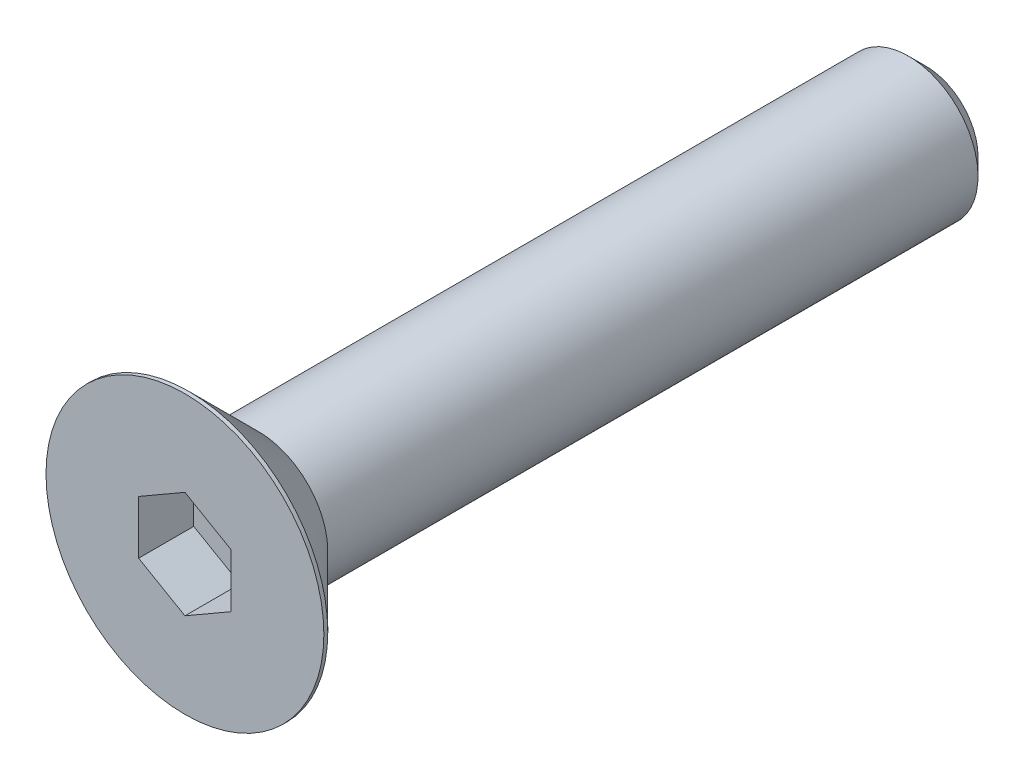
ISO-10303-21;
HEADER;
FILE_DESCRIPTION(('STEP AP214'),'2;1');
FILE_NAME('part.step','',(''),(''),'','','');
FILE_SCHEMA(('AUTOMOTIVE_DESIGN { 1 0 10303 214 1 1 1 1 }'));
ENDSEC;
DATA;
#1=APPLICATION_CONTEXT('core data for automotive mechanical design processes');
#2=APPLICATION_PROTOCOL_DEFINITION('international standard','automotive_design',2000,#1);
#3=PRODUCT_CONTEXT('',#1,'mechanical');
#4=PRODUCT('Part','Part','',(#3));
#5=PRODUCT_RELATED_PRODUCT_CATEGORY('part','',(#4));
#6=PRODUCT_DEFINITION_FORMATION('','',#4);
#7=PRODUCT_DEFINITION_CONTEXT('part definition',#1,'design');
#8=PRODUCT_DEFINITION('design','',#6,#7);
#9=PRODUCT_DEFINITION_SHAPE('','',#8);
#10=(LENGTH_UNIT() NAMED_UNIT(*) SI_UNIT(.MILLI.,.METRE.));
#11=(NAMED_UNIT(*) PLANE_ANGLE_UNIT() SI_UNIT($,.RADIAN.));
#12=(NAMED_UNIT(*) SI_UNIT($,.STERADIAN.) SOLID_ANGLE_UNIT());
#13=UNCERTAINTY_MEASURE_WITH_UNIT(LENGTH_MEASURE(1.E-05),#10,'distance_accuracy_value','');
#14=(GEOMETRIC_REPRESENTATION_CONTEXT(3) GLOBAL_UNCERTAINTY_ASSIGNED_CONTEXT((#13)) GLOBAL_UNIT_ASSIGNED_CONTEXT((#10,
#11,#12)) REPRESENTATION_CONTEXT('',''));
#15=CARTESIAN_POINT('',(0.,0.,0.));
#16=DIRECTION('',(0.,0.,1.));
#17=DIRECTION('',(1.,0.,0.));
#18=AXIS2_PLACEMENT_3D('',#15,#16,#17);
#19=CARTESIAN_POINT('',(0.,0.,7.915));
#20=DIRECTION('',(0.,0.,1.));
#21=DIRECTION('',(0.,-1.,0.));
#22=AXIS2_PLACEMENT_3D('',#19,#20,#21);
#23=CONICAL_SURFACE('',#22,3.,0.785398163397448);
#24=CARTESIAN_POINT('',(0.,0.,6.3));
#25=DIRECTION('',(0.,0.,1.));
#26=DIRECTION('',(0.,-1.,0.));
#27=AXIS2_PLACEMENT_3D('',#24,#25,#26);
#28=CIRCLE('',#27,1.385);
#29=CARTESIAN_POINT('',(0.,-1.385,6.3));
#30=VERTEX_POINT('',#29);
#31=EDGE_CURVE('E150',#30,#30,#28,.T.);
#32=ORIENTED_EDGE('',*,*,#31,.T.);
#33=EDGE_LOOP('',(#32));
#34=FACE_BOUND('',#33,.T.);
#35=CARTESIAN_POINT('',(0.,0.,7.915));
#36=DIRECTION('',(0.,0.,1.));
#37=DIRECTION('',(0.,-1.,0.));
#38=AXIS2_PLACEMENT_3D('',#35,#36,#37);
#39=CIRCLE('',#38,3.);
#40=CARTESIAN_POINT('',(0.,-3.,7.915));
#41=VERTEX_POINT('',#40);
#42=EDGE_CURVE('E12',#41,#41,#39,.T.);
#43=ORIENTED_EDGE('',*,*,#42,.F.);
#44=EDGE_LOOP('',(#43));
#45=FACE_BOUND('',#44,.T.);
#46=ADVANCED_FACE('F49',(#34,#45),#23,.T.);
#47=CARTESIAN_POINT('',(0.,0.,8.));
#48=DIRECTION('',(0.,0.,1.));
#49=DIRECTION('',(0.,-1.,0.));
#50=AXIS2_PLACEMENT_3D('',#47,#48,#49);
#51=CYLINDRICAL_SURFACE('',#50,3.);
#52=ORIENTED_EDGE('',*,*,#42,.T.);
#53=EDGE_LOOP('',(#52));
#54=FACE_BOUND('',#53,.T.);
#55=CARTESIAN_POINT('',(0.,0.,8.));
#56=DIRECTION('',(0.,0.,1.));
#57=DIRECTION('',(0.,-1.,0.));
#58=AXIS2_PLACEMENT_3D('',#55,#56,#57);
#59=CIRCLE('',#58,3.);
#60=CARTESIAN_POINT('',(0.,-3.,8.));
#61=VERTEX_POINT('',#60);
#62=EDGE_CURVE('E56',#61,#61,#59,.T.);
#63=ORIENTED_EDGE('',*,*,#62,.F.);
#64=EDGE_LOOP('',(#63));
#65=FACE_BOUND('',#64,.T.);
#66=ADVANCED_FACE('F162',(#54,#65),#51,.T.);
#67=CARTESIAN_POINT('',(0.,0.,8.));
#68=DIRECTION('',(0.,0.,-1.));
#69=DIRECTION('',(0.,1.,0.));
#70=AXIS2_PLACEMENT_3D('',#67,#68,#69);
#71=PLANE('',#70);
#72=DIRECTION('',(0.,1.,0.));
#73=VECTOR('',#72,1.);
#74=CARTESIAN_POINT('',(1.,-0.577350269189627,8.));
#75=LINE('',#74,#73);
#76=CARTESIAN_POINT('',(1.,-0.577350269189627,8.));
#77=VERTEX_POINT('',#76);
#78=CARTESIAN_POINT('',(1.,0.577350269189625,8.));
#79=VERTEX_POINT('',#78);
#80=EDGE_CURVE('E137',#77,#79,#75,.T.);
#81=ORIENTED_EDGE('',*,*,#80,.F.);
#82=DIRECTION('',(0.866025403784438,0.5,0.));
#83=VECTOR('',#82,1.);
#84=CARTESIAN_POINT('',(0.,-1.15470053837926,8.));
#85=LINE('',#84,#83);
#86=CARTESIAN_POINT('',(0.,-1.15470053837926,8.));
#87=VERTEX_POINT('',#86);
#88=EDGE_CURVE('E63',#87,#77,#85,.T.);
#89=ORIENTED_EDGE('',*,*,#88,.F.);
#90=DIRECTION('',(0.866025403784438,-0.5,0.));
#91=VECTOR('',#90,1.);
#92=CARTESIAN_POINT('',(-1.,-0.577350269189629,8.));
#93=LINE('',#92,#91);
#94=CARTESIAN_POINT('',(-1.,-0.577350269189629,8.));
#95=VERTEX_POINT('',#94);
#96=EDGE_CURVE('E146',#95,#87,#93,.T.);
#97=ORIENTED_EDGE('',*,*,#96,.F.);
#98=DIRECTION('',(0.,-1.,0.));
#99=VECTOR('',#98,1.);
#100=CARTESIAN_POINT('',(-1.,0.577350269189625,8.));
#101=LINE('',#100,#99);
#102=CARTESIAN_POINT('',(-1.,0.577350269189625,8.));
#103=VERTEX_POINT('',#102);
#104=EDGE_CURVE('E144',#103,#95,#101,.T.);
#105=ORIENTED_EDGE('',*,*,#104,.F.);
#106=DIRECTION('',(-0.866025403784439,-0.5,0.));
#107=VECTOR('',#106,1.);
#108=CARTESIAN_POINT('',(0.,1.15470053837925,8.));
#109=LINE('',#108,#107);
#110=CARTESIAN_POINT('',(0.,1.15470053837925,8.));
#111=VERTEX_POINT('',#110);
#112=EDGE_CURVE('E111',#111,#103,#109,.T.);
#113=ORIENTED_EDGE('',*,*,#112,.F.);
#114=DIRECTION('',(-0.866025403784439,0.5,0.));
#115=VECTOR('',#114,1.);
#116=CARTESIAN_POINT('',(1.,0.577350269189625,8.));
#117=LINE('',#116,#115);
#118=EDGE_CURVE('E140',#79,#111,#117,.T.);
#119=ORIENTED_EDGE('',*,*,#118,.F.);
#120=EDGE_LOOP('',(#81,#89,#97,#105,#113,#119));
#121=FACE_BOUND('',#120,.T.);
#122=ORIENTED_EDGE('',*,*,#62,.T.);
#123=EDGE_LOOP('',(#122));
#124=FACE_BOUND('',#123,.T.);
#125=ADVANCED_FACE('F160',(#121,#124),#71,.F.);
#126=CARTESIAN_POINT('',(0.,0.,6.3));
#127=DIRECTION('',(0.,0.,-1.));
#128=DIRECTION('',(0.,1.,0.));
#129=AXIS2_PLACEMENT_3D('',#126,#127,#128);
#130=PLANE('',#129);
#131=ORIENTED_EDGE('',*,*,#31,.F.);
#132=EDGE_LOOP('',(#131));
#133=FACE_BOUND('',#132,.T.);
#134=ADVANCED_FACE('F169',(#133),#130,.T.);
#135=CARTESIAN_POINT('',(0.,-1.15470053837926,6.81));
#136=DIRECTION('',(0.5,-0.866025403784438,0.));
#137=DIRECTION('',(0.866025403784439,0.5,0.));
#138=AXIS2_PLACEMENT_3D('',#135,#136,#137);
#139=PLANE('',#138);
#140=ORIENTED_EDGE('',*,*,#88,.T.);
#141=DIRECTION('',(0.,0.,1.));
#142=VECTOR('',#141,1.);
#143=CARTESIAN_POINT('',(1.,-0.577350269189627,6.81));
#144=LINE('',#143,#142);
#145=CARTESIAN_POINT('',(1.,-0.577350269189627,6.81));
#146=VERTEX_POINT('',#145);
#147=EDGE_CURVE('E93',#146,#77,#144,.T.);
#148=ORIENTED_EDGE('',*,*,#147,.F.);
#149=DIRECTION('',(0.866025403784438,0.5,0.));
#150=VECTOR('',#149,1.);
#151=CARTESIAN_POINT('',(0.,-1.15470053837926,6.81));
#152=LINE('',#151,#150);
#153=CARTESIAN_POINT('',(0.,-1.15470053837926,6.81));
#154=VERTEX_POINT('',#153);
#155=EDGE_CURVE('E148',#154,#146,#152,.T.);
#156=ORIENTED_EDGE('',*,*,#155,.F.);
#157=DIRECTION('',(0.,0.,1.));
#158=VECTOR('',#157,1.);
#159=CARTESIAN_POINT('',(0.,-1.15470053837926,6.81));
#160=LINE('',#159,#158);
#161=EDGE_CURVE('E71',#154,#87,#160,.T.);
#162=ORIENTED_EDGE('',*,*,#161,.T.);
#163=EDGE_LOOP('',(#140,#148,#156,#162));
#164=FACE_BOUND('',#163,.T.);
#165=ADVANCED_FACE('F176',(#164),#139,.F.);
#166=CARTESIAN_POINT('',(-1.,-0.577350269189629,6.81));
#167=DIRECTION('',(-0.5,-0.866025403784439,0.));
#168=DIRECTION('',(0.866025403784439,-0.5,0.));
#169=AXIS2_PLACEMENT_3D('',#166,#167,#168);
#170=PLANE('',#169);
#171=ORIENTED_EDGE('',*,*,#96,.T.);
#172=ORIENTED_EDGE('',*,*,#161,.F.);
#173=DIRECTION('',(0.866025403784438,-0.5,0.));
#174=VECTOR('',#173,1.);
#175=CARTESIAN_POINT('',(-1.,-0.577350269189629,6.81));
#176=LINE('',#175,#174);
#177=CARTESIAN_POINT('',(-1.,-0.577350269189629,6.81));
#178=VERTEX_POINT('',#177);
#179=EDGE_CURVE('E123',#178,#154,#176,.T.);
#180=ORIENTED_EDGE('',*,*,#179,.F.);
#181=DIRECTION('',(0.,0.,1.));
#182=VECTOR('',#181,1.);
#183=CARTESIAN_POINT('',(-1.,-0.577350269189629,6.81));
#184=LINE('',#183,#182);
#185=EDGE_CURVE('E115',#178,#95,#184,.T.);
#186=ORIENTED_EDGE('',*,*,#185,.T.);
#187=EDGE_LOOP('',(#171,#172,#180,#186));
#188=FACE_BOUND('',#187,.T.);
#189=ADVANCED_FACE('F180',(#188),#170,.F.);
#190=CARTESIAN_POINT('',(-1.,0.577350269189625,6.81));
#191=DIRECTION('',(-1.,0.,0.));
#192=DIRECTION('',(0.,-1.,0.));
#193=AXIS2_PLACEMENT_3D('',#190,#191,#192);
#194=PLANE('',#193);
#195=ORIENTED_EDGE('',*,*,#104,.T.);
#196=ORIENTED_EDGE('',*,*,#185,.F.);
#197=DIRECTION('',(0.,-1.,0.));
#198=VECTOR('',#197,1.);
#199=CARTESIAN_POINT('',(-1.,0.577350269189625,6.81));
#200=LINE('',#199,#198);
#201=CARTESIAN_POINT('',(-1.,0.577350269189625,6.81));
#202=VERTEX_POINT('',#201);
#203=EDGE_CURVE('E119',#202,#178,#200,.T.);
#204=ORIENTED_EDGE('',*,*,#203,.F.);
#205=DIRECTION('',(0.,0.,1.));
#206=VECTOR('',#205,1.);
#207=CARTESIAN_POINT('',(-1.,0.577350269189625,6.81));
#208=LINE('',#207,#206);
#209=EDGE_CURVE('E104',#202,#103,#208,.T.);
#210=ORIENTED_EDGE('',*,*,#209,.T.);
#211=EDGE_LOOP('',(#195,#196,#204,#210));
#212=FACE_BOUND('',#211,.T.);
#213=ADVANCED_FACE('F120',(#212),#194,.F.);
#214=CARTESIAN_POINT('',(0.,1.15470053837925,6.81));
#215=DIRECTION('',(-0.5,0.866025403784439,0.));
#216=DIRECTION('',(-0.866025403784439,-0.5,0.));
#217=AXIS2_PLACEMENT_3D('',#214,#215,#216);
#218=PLANE('',#217);
#219=ORIENTED_EDGE('',*,*,#112,.T.);
#220=ORIENTED_EDGE('',*,*,#209,.F.);
#221=DIRECTION('',(-0.866025403784439,-0.5,0.));
#222=VECTOR('',#221,1.);
#223=CARTESIAN_POINT('',(0.,1.15470053837925,6.81));
#224=LINE('',#223,#222);
#225=CARTESIAN_POINT('',(0.,1.15470053837925,6.81));
#226=VERTEX_POINT('',#225);
#227=EDGE_CURVE('E108',#226,#202,#224,.T.);
#228=ORIENTED_EDGE('',*,*,#227,.F.);
#229=DIRECTION('',(0.,0.,1.));
#230=VECTOR('',#229,1.);
#231=CARTESIAN_POINT('',(0.,1.15470053837925,6.81));
#232=LINE('',#231,#230);
#233=EDGE_CURVE('E116',#226,#111,#232,.T.);
#234=ORIENTED_EDGE('',*,*,#233,.T.);
#235=EDGE_LOOP('',(#219,#220,#228,#234));
#236=FACE_BOUND('',#235,.T.);
#237=ADVANCED_FACE('F106',(#236),#218,.F.);
#238=CARTESIAN_POINT('',(1.,0.577350269189625,6.81));
#239=DIRECTION('',(0.5,0.866025403784439,0.));
#240=DIRECTION('',(-0.866025403784439,0.5,0.));
#241=AXIS2_PLACEMENT_3D('',#238,#239,#240);
#242=PLANE('',#241);
#243=ORIENTED_EDGE('',*,*,#118,.T.);
#244=ORIENTED_EDGE('',*,*,#233,.F.);
#245=DIRECTION('',(-0.866025403784439,0.5,0.));
#246=VECTOR('',#245,1.);
#247=CARTESIAN_POINT('',(1.,0.577350269189625,6.81));
#248=LINE('',#247,#246);
#249=CARTESIAN_POINT('',(1.,0.577350269189625,6.81));
#250=VERTEX_POINT('',#249);
#251=EDGE_CURVE('E129',#250,#226,#248,.T.);
#252=ORIENTED_EDGE('',*,*,#251,.F.);
#253=DIRECTION('',(0.,0.,1.));
#254=VECTOR('',#253,1.);
#255=CARTESIAN_POINT('',(1.,0.577350269189625,6.81));
#256=LINE('',#255,#254);
#257=EDGE_CURVE('E153',#250,#79,#256,.T.);
#258=ORIENTED_EDGE('',*,*,#257,.T.);
#259=EDGE_LOOP('',(#243,#244,#252,#258));
#260=FACE_BOUND('',#259,.T.);
#261=ADVANCED_FACE('F184',(#260),#242,.F.);
#262=CARTESIAN_POINT('',(1.,-0.577350269189627,6.81));
#263=DIRECTION('',(1.,0.,0.));
#264=DIRECTION('',(0.,1.,0.));
#265=AXIS2_PLACEMENT_3D('',#262,#263,#264);
#266=PLANE('',#265);
#267=ORIENTED_EDGE('',*,*,#80,.T.);
#268=ORIENTED_EDGE('',*,*,#257,.F.);
#269=DIRECTION('',(0.,1.,0.));
#270=VECTOR('',#269,1.);
#271=CARTESIAN_POINT('',(1.,-0.577350269189627,6.81));
#272=LINE('',#271,#270);
#273=EDGE_CURVE('E131',#146,#250,#272,.T.);
#274=ORIENTED_EDGE('',*,*,#273,.F.);
#275=ORIENTED_EDGE('',*,*,#147,.T.);
#276=EDGE_LOOP('',(#267,#268,#274,#275));
#277=FACE_BOUND('',#276,.T.);
#278=ADVANCED_FACE('F181',(#277),#266,.F.);
#279=CARTESIAN_POINT('',(1.,-0.577350269189627,6.81));
#280=DIRECTION('',(0.,0.,1.));
#281=DIRECTION('',(1.,0.,0.));
#282=AXIS2_PLACEMENT_3D('',#279,#280,#281);
#283=PLANE('',#282);
#284=ORIENTED_EDGE('',*,*,#155,.T.);
#285=ORIENTED_EDGE('',*,*,#273,.T.);
#286=ORIENTED_EDGE('',*,*,#251,.T.);
#287=ORIENTED_EDGE('',*,*,#227,.T.);
#288=ORIENTED_EDGE('',*,*,#203,.T.);
#289=ORIENTED_EDGE('',*,*,#179,.T.);
#290=EDGE_LOOP('',(#284,#285,#286,#287,#288,#289));
#291=FACE_BOUND('',#290,.T.);
#292=ADVANCED_FACE('F126',(#291),#283,.T.);
#293=CLOSED_SHELL('',(#46,#66,#125,#134,#165,#189,#213,#237,#261,#278,#292));
#294=MANIFOLD_SOLID_BREP('B2',#293);
#295=CARTESIAN_POINT('',(0.,-1.50000000000001,6.81000000000001));
#296=DIRECTION('',(0.,0.,-1.));
#297=DIRECTION('',(0.,1.,0.));
#298=AXIS2_PLACEMENT_3D('',#295,#296,#297);
#299=PLANE('',#298);
#300=CARTESIAN_POINT('',(0.,0.,6.81000000000001));
#301=DIRECTION('',(0.,0.,1.));
#302=DIRECTION('',(0.,-1.,0.));
#303=AXIS2_PLACEMENT_3D('',#300,#301,#302);
#304=CIRCLE('',#303,1.50000000000001);
#305=CARTESIAN_POINT('',(0.,-1.50000000000001,6.81000000000001));
#306=VERTEX_POINT('',#305);
#307=EDGE_CURVE('E283',#306,#306,#304,.T.);
#308=ORIENTED_EDGE('',*,*,#307,.T.);
#309=EDGE_LOOP('',(#308));
#310=FACE_BOUND('',#309,.T.);
#311=ADVANCED_FACE('F270',(#310),#299,.F.);
#312=CARTESIAN_POINT('',(0.,-1.5,-8.00000000000001));
#313=DIRECTION('',(0.,0.,1.));
#314=DIRECTION('',(0.,-1.,0.));
#315=AXIS2_PLACEMENT_3D('',#312,#313,#314);
#316=PLANE('',#315);
#317=CARTESIAN_POINT('',(0.,0.,-8.00000000000001));
#318=DIRECTION('',(0.,0.,1.));
#319=DIRECTION('',(0.,-1.,0.));
#320=AXIS2_PLACEMENT_3D('',#317,#318,#319);
#321=CIRCLE('',#320,1.125);
#322=CARTESIAN_POINT('',(0.,-1.125,-8.00000000000001));
#323=VERTEX_POINT('',#322);
#324=EDGE_CURVE('E48',#323,#323,#321,.F.);
#325=ORIENTED_EDGE('',*,*,#324,.T.);
#326=EDGE_LOOP('',(#325));
#327=FACE_BOUND('',#326,.T.);
#328=ADVANCED_FACE('F294',(#327),#316,.F.);
#329=CARTESIAN_POINT('',(0.,0.,6.81));
#330=DIRECTION('',(0.,0.,1.));
#331=DIRECTION('',(0.,-1.,0.));
#332=AXIS2_PLACEMENT_3D('',#329,#330,#331);
#333=CYLINDRICAL_SURFACE('',#332,1.50000000000001);
#334=CARTESIAN_POINT('',(0.,0.,-7.62500000000001));
#335=DIRECTION('',(0.,0.,1.));
#336=DIRECTION('',(0.,-1.,0.));
#337=AXIS2_PLACEMENT_3D('',#334,#335,#336);
#338=CIRCLE('',#337,1.50000000000001);
#339=CARTESIAN_POINT('',(0.,-1.50000000000001,-7.62500000000001));
#340=VERTEX_POINT('',#339);
#341=EDGE_CURVE('E278',#340,#340,#338,.T.);
#342=ORIENTED_EDGE('',*,*,#341,.T.);
#343=EDGE_LOOP('',(#342));
#344=FACE_BOUND('',#343,.T.);
#345=ORIENTED_EDGE('',*,*,#307,.F.);
#346=EDGE_LOOP('',(#345));
#347=FACE_BOUND('',#346,.T.);
#348=ADVANCED_FACE('F292',(#344,#347),#333,.T.);
#349=CARTESIAN_POINT('',(0.,0.,-7.62500000000001));
#350=DIRECTION('',(0.,0.,1.));
#351=DIRECTION('',(0.,-1.,0.));
#352=AXIS2_PLACEMENT_3D('',#349,#350,#351);
#353=CONICAL_SURFACE('',#352,1.50000000000001,0.785398163397452);
#354=ORIENTED_EDGE('',*,*,#324,.F.);
#355=EDGE_LOOP('',(#354));
#356=FACE_BOUND('',#355,.T.);
#357=ORIENTED_EDGE('',*,*,#341,.F.);
#358=EDGE_LOOP('',(#357));
#359=FACE_BOUND('',#358,.T.);
#360=ADVANCED_FACE('F272',(#356,#359),#353,.T.);
#361=CLOSED_SHELL('',(#311,#328,#348,#360));
#362=MANIFOLD_SOLID_BREP('B6',#361);
#363=ADVANCED_BREP_SHAPE_REPRESENTATION('',(#18,#294,#362),#14);
#364=SHAPE_DEFINITION_REPRESENTATION(#9,#363);
ENDSEC;
END-ISO-10303-21;
